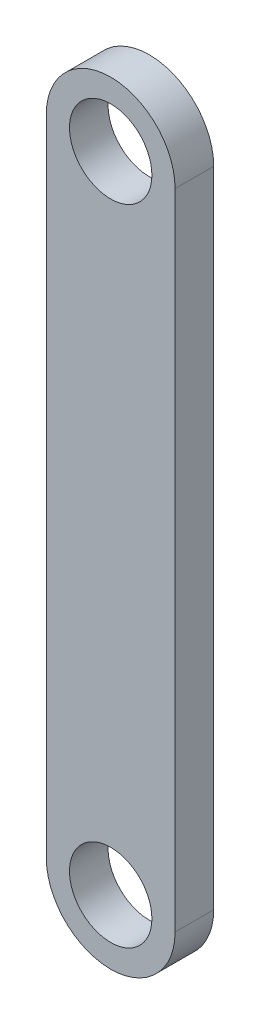
ISO-10303-21;
HEADER;
FILE_DESCRIPTION(('STEP AP214'),'2;1');
FILE_NAME('part.step','',(''),(''),'','','');
FILE_SCHEMA(('AUTOMOTIVE_DESIGN { 1 0 10303 214 1 1 1 1 }'));
ENDSEC;
DATA;
#1=APPLICATION_CONTEXT('core data for automotive mechanical design processes');
#2=APPLICATION_PROTOCOL_DEFINITION('international standard','automotive_design',2000,#1);
#3=PRODUCT_CONTEXT('',#1,'mechanical');
#4=PRODUCT('Part','Part','',(#3));
#5=PRODUCT_RELATED_PRODUCT_CATEGORY('part','',(#4));
#6=PRODUCT_DEFINITION_FORMATION('','',#4);
#7=PRODUCT_DEFINITION_CONTEXT('part definition',#1,'design');
#8=PRODUCT_DEFINITION('design','',#6,#7);
#9=PRODUCT_DEFINITION_SHAPE('','',#8);
#10=(LENGTH_UNIT() NAMED_UNIT(*) SI_UNIT(.MILLI.,.METRE.));
#11=(NAMED_UNIT(*) PLANE_ANGLE_UNIT() SI_UNIT($,.RADIAN.));
#12=(NAMED_UNIT(*) SI_UNIT($,.STERADIAN.) SOLID_ANGLE_UNIT());
#13=UNCERTAINTY_MEASURE_WITH_UNIT(LENGTH_MEASURE(1.E-05),#10,'distance_accuracy_value','');
#14=(GEOMETRIC_REPRESENTATION_CONTEXT(3) GLOBAL_UNCERTAINTY_ASSIGNED_CONTEXT((#13)) GLOBAL_UNIT_ASSIGNED_CONTEXT((#10,
#11,#12)) REPRESENTATION_CONTEXT('',''));
#15=CARTESIAN_POINT('',(0.,0.,0.));
#16=DIRECTION('',(0.,0.,1.));
#17=DIRECTION('',(1.,0.,0.));
#18=AXIS2_PLACEMENT_3D('',#15,#16,#17);
#19=CARTESIAN_POINT('',(10.,0.,6.));
#20=DIRECTION('',(0.,0.,-1.));
#21=DIRECTION('',(-1.,0.,0.));
#22=AXIS2_PLACEMENT_3D('',#19,#20,#21);
#23=PLANE('',#22);
#24=CARTESIAN_POINT('',(10.,0.,6.));
#25=DIRECTION('',(0.,0.,1.));
#26=DIRECTION('',(-1.,0.,0.));
#27=AXIS2_PLACEMENT_3D('',#24,#25,#26);
#28=CIRCLE('',#27,10.);
#29=CARTESIAN_POINT('',(0.,0.,6.));
#30=VERTEX_POINT('',#29);
#31=CARTESIAN_POINT('',(20.,0.,6.));
#32=VERTEX_POINT('',#31);
#33=EDGE_CURVE('E96',#30,#32,#28,.T.);
#34=ORIENTED_EDGE('',*,*,#33,.T.);
#35=DIRECTION('',(0.,1.,0.));
#36=VECTOR('',#35,1.);
#37=CARTESIAN_POINT('',(20.,100.,6.));
#38=LINE('',#37,#36);
#39=CARTESIAN_POINT('',(20.,100.,6.));
#40=VERTEX_POINT('',#39);
#41=EDGE_CURVE('E91',#32,#40,#38,.T.);
#42=ORIENTED_EDGE('',*,*,#41,.T.);
#43=CARTESIAN_POINT('',(9.99999999999998,100.,6.));
#44=DIRECTION('',(0.,0.,1.));
#45=DIRECTION('',(-1.,0.,0.));
#46=AXIS2_PLACEMENT_3D('',#43,#44,#45);
#47=CIRCLE('',#46,10.);
#48=CARTESIAN_POINT('',(0.,100.,6.));
#49=VERTEX_POINT('',#48);
#50=EDGE_CURVE('E94',#40,#49,#47,.T.);
#51=ORIENTED_EDGE('',*,*,#50,.T.);
#52=DIRECTION('',(0.,-1.,0.));
#53=VECTOR('',#52,1.);
#54=CARTESIAN_POINT('',(0.,0.,6.));
#55=LINE('',#54,#53);
#56=EDGE_CURVE('E61',#49,#30,#55,.T.);
#57=ORIENTED_EDGE('',*,*,#56,.T.);
#58=EDGE_LOOP('',(#34,#42,#51,#57));
#59=FACE_BOUND('',#58,.T.);
#60=CARTESIAN_POINT('',(9.99999999999998,100.,6.));
#61=DIRECTION('',(0.,0.,1.));
#62=DIRECTION('',(1.,0.,0.));
#63=AXIS2_PLACEMENT_3D('',#60,#61,#62);
#64=CIRCLE('',#63,6.39999999999999);
#65=CARTESIAN_POINT('',(16.4,100.,6.));
#66=VERTEX_POINT('',#65);
#67=EDGE_CURVE('E116',#66,#66,#64,.T.);
#68=ORIENTED_EDGE('',*,*,#67,.F.);
#69=EDGE_LOOP('',(#68));
#70=FACE_BOUND('',#69,.T.);
#71=CARTESIAN_POINT('',(9.99999999999999,0.,6.));
#72=DIRECTION('',(0.,0.,1.));
#73=DIRECTION('',(1.,0.,0.));
#74=AXIS2_PLACEMENT_3D('',#71,#72,#73);
#75=CIRCLE('',#74,6.40000000000003);
#76=CARTESIAN_POINT('',(16.4,0.,6.));
#77=VERTEX_POINT('',#76);
#78=EDGE_CURVE('E138',#77,#77,#75,.T.);
#79=ORIENTED_EDGE('',*,*,#78,.F.);
#80=EDGE_LOOP('',(#79));
#81=FACE_BOUND('',#80,.T.);
#82=ADVANCED_FACE('F43',(#59,#70,#81),#23,.F.);
#83=CARTESIAN_POINT('',(10.,0.,0.));
#84=DIRECTION('',(0.,0.,-1.));
#85=DIRECTION('',(-1.,0.,0.));
#86=AXIS2_PLACEMENT_3D('',#83,#84,#85);
#87=PLANE('',#86);
#88=CARTESIAN_POINT('',(9.99999999999998,100.,0.));
#89=DIRECTION('',(0.,0.,1.));
#90=DIRECTION('',(1.,0.,0.));
#91=AXIS2_PLACEMENT_3D('',#88,#89,#90);
#92=CIRCLE('',#91,6.39999999999999);
#93=CARTESIAN_POINT('',(16.4,100.,0.));
#94=VERTEX_POINT('',#93);
#95=EDGE_CURVE('E134',#94,#94,#92,.T.);
#96=ORIENTED_EDGE('',*,*,#95,.T.);
#97=EDGE_LOOP('',(#96));
#98=FACE_BOUND('',#97,.T.);
#99=CARTESIAN_POINT('',(10.,0.,0.));
#100=DIRECTION('',(0.,0.,1.));
#101=DIRECTION('',(-1.,0.,0.));
#102=AXIS2_PLACEMENT_3D('',#99,#100,#101);
#103=CIRCLE('',#102,10.);
#104=CARTESIAN_POINT('',(0.,0.,0.));
#105=VERTEX_POINT('',#104);
#106=CARTESIAN_POINT('',(20.,0.,0.));
#107=VERTEX_POINT('',#106);
#108=EDGE_CURVE('E112',#105,#107,#103,.T.);
#109=ORIENTED_EDGE('',*,*,#108,.F.);
#110=DIRECTION('',(0.,-1.,0.));
#111=VECTOR('',#110,1.);
#112=CARTESIAN_POINT('',(0.,0.,0.));
#113=LINE('',#112,#111);
#114=CARTESIAN_POINT('',(0.,100.,0.));
#115=VERTEX_POINT('',#114);
#116=EDGE_CURVE('E84',#115,#105,#113,.T.);
#117=ORIENTED_EDGE('',*,*,#116,.F.);
#118=CARTESIAN_POINT('',(9.99999999999998,100.,0.));
#119=DIRECTION('',(0.,0.,1.));
#120=DIRECTION('',(-1.,0.,0.));
#121=AXIS2_PLACEMENT_3D('',#118,#119,#120);
#122=CIRCLE('',#121,10.);
#123=CARTESIAN_POINT('',(20.,100.,0.));
#124=VERTEX_POINT('',#123);
#125=EDGE_CURVE('E78',#124,#115,#122,.T.);
#126=ORIENTED_EDGE('',*,*,#125,.F.);
#127=DIRECTION('',(0.,1.,0.));
#128=VECTOR('',#127,1.);
#129=CARTESIAN_POINT('',(20.,100.,0.));
#130=LINE('',#129,#128);
#131=EDGE_CURVE('E101',#107,#124,#130,.T.);
#132=ORIENTED_EDGE('',*,*,#131,.F.);
#133=EDGE_LOOP('',(#109,#117,#126,#132));
#134=FACE_BOUND('',#133,.T.);
#135=CARTESIAN_POINT('',(9.99999999999999,0.,0.));
#136=DIRECTION('',(0.,0.,1.));
#137=DIRECTION('',(1.,0.,0.));
#138=AXIS2_PLACEMENT_3D('',#135,#136,#137);
#139=CIRCLE('',#138,6.40000000000003);
#140=CARTESIAN_POINT('',(16.4,0.,0.));
#141=VERTEX_POINT('',#140);
#142=EDGE_CURVE('E142',#141,#141,#139,.T.);
#143=ORIENTED_EDGE('',*,*,#142,.T.);
#144=EDGE_LOOP('',(#143));
#145=FACE_BOUND('',#144,.T.);
#146=ADVANCED_FACE('F129',(#98,#134,#145),#87,.T.);
#147=CARTESIAN_POINT('',(10.,0.,6.));
#148=DIRECTION('',(0.,0.,-1.));
#149=DIRECTION('',(-1.,0.,0.));
#150=AXIS2_PLACEMENT_3D('',#147,#148,#149);
#151=CYLINDRICAL_SURFACE('',#150,10.);
#152=ORIENTED_EDGE('',*,*,#108,.T.);
#153=DIRECTION('',(0.,0.,-1.));
#154=VECTOR('',#153,1.);
#155=CARTESIAN_POINT('',(20.,0.,6.));
#156=LINE('',#155,#154);
#157=EDGE_CURVE('E11',#32,#107,#156,.T.);
#158=ORIENTED_EDGE('',*,*,#157,.F.);
#159=ORIENTED_EDGE('',*,*,#33,.F.);
#160=DIRECTION('',(0.,0.,-1.));
#161=VECTOR('',#160,1.);
#162=CARTESIAN_POINT('',(0.,0.,6.));
#163=LINE('',#162,#161);
#164=EDGE_CURVE('E108',#30,#105,#163,.T.);
#165=ORIENTED_EDGE('',*,*,#164,.T.);
#166=EDGE_LOOP('',(#152,#158,#159,#165));
#167=FACE_BOUND('',#166,.T.);
#168=ADVANCED_FACE('F45',(#167),#151,.T.);
#169=CARTESIAN_POINT('',(20.,100.,6.));
#170=DIRECTION('',(-1.,0.,0.));
#171=DIRECTION('',(0.,-1.,0.));
#172=AXIS2_PLACEMENT_3D('',#169,#170,#171);
#173=PLANE('',#172);
#174=ORIENTED_EDGE('',*,*,#131,.T.);
#175=DIRECTION('',(0.,0.,-1.));
#176=VECTOR('',#175,1.);
#177=CARTESIAN_POINT('',(20.,100.,6.));
#178=LINE('',#177,#176);
#179=EDGE_CURVE('E53',#40,#124,#178,.T.);
#180=ORIENTED_EDGE('',*,*,#179,.F.);
#181=ORIENTED_EDGE('',*,*,#41,.F.);
#182=ORIENTED_EDGE('',*,*,#157,.T.);
#183=EDGE_LOOP('',(#174,#180,#181,#182));
#184=FACE_BOUND('',#183,.T.);
#185=ADVANCED_FACE('F100',(#184),#173,.F.);
#186=CARTESIAN_POINT('',(9.99999999999998,100.,6.));
#187=DIRECTION('',(0.,0.,-1.));
#188=DIRECTION('',(-1.,0.,0.));
#189=AXIS2_PLACEMENT_3D('',#186,#187,#188);
#190=CYLINDRICAL_SURFACE('',#189,10.);
#191=ORIENTED_EDGE('',*,*,#125,.T.);
#192=DIRECTION('',(0.,0.,-1.));
#193=VECTOR('',#192,1.);
#194=CARTESIAN_POINT('',(0.,100.,6.));
#195=LINE('',#194,#193);
#196=EDGE_CURVE('E103',#49,#115,#195,.T.);
#197=ORIENTED_EDGE('',*,*,#196,.F.);
#198=ORIENTED_EDGE('',*,*,#50,.F.);
#199=ORIENTED_EDGE('',*,*,#179,.T.);
#200=EDGE_LOOP('',(#191,#197,#198,#199));
#201=FACE_BOUND('',#200,.T.);
#202=ADVANCED_FACE('F104',(#201),#190,.T.);
#203=CARTESIAN_POINT('',(0.,0.,6.));
#204=DIRECTION('',(1.,0.,0.));
#205=DIRECTION('',(0.,1.,0.));
#206=AXIS2_PLACEMENT_3D('',#203,#204,#205);
#207=PLANE('',#206);
#208=ORIENTED_EDGE('',*,*,#116,.T.);
#209=ORIENTED_EDGE('',*,*,#164,.F.);
#210=ORIENTED_EDGE('',*,*,#56,.F.);
#211=ORIENTED_EDGE('',*,*,#196,.T.);
#212=EDGE_LOOP('',(#208,#209,#210,#211));
#213=FACE_BOUND('',#212,.T.);
#214=ADVANCED_FACE('F126',(#213),#207,.F.);
#215=CARTESIAN_POINT('',(9.99999999999998,100.,6.));
#216=DIRECTION('',(0.,0.,-1.));
#217=DIRECTION('',(-1.,0.,0.));
#218=AXIS2_PLACEMENT_3D('',#215,#216,#217);
#219=CYLINDRICAL_SURFACE('',#218,6.39999999999999);
#220=ORIENTED_EDGE('',*,*,#67,.T.);
#221=EDGE_LOOP('',(#220));
#222=FACE_BOUND('',#221,.T.);
#223=ORIENTED_EDGE('',*,*,#95,.F.);
#224=EDGE_LOOP('',(#223));
#225=FACE_BOUND('',#224,.T.);
#226=ADVANCED_FACE('F161',(#222,#225),#219,.F.);
#227=CARTESIAN_POINT('',(9.99999999999999,0.,6.));
#228=DIRECTION('',(0.,0.,-1.));
#229=DIRECTION('',(-1.,0.,0.));
#230=AXIS2_PLACEMENT_3D('',#227,#228,#229);
#231=CYLINDRICAL_SURFACE('',#230,6.40000000000003);
#232=ORIENTED_EDGE('',*,*,#78,.T.);
#233=EDGE_LOOP('',(#232));
#234=FACE_BOUND('',#233,.T.);
#235=ORIENTED_EDGE('',*,*,#142,.F.);
#236=EDGE_LOOP('',(#235));
#237=FACE_BOUND('',#236,.T.);
#238=ADVANCED_FACE('F150',(#234,#237),#231,.F.);
#239=CLOSED_SHELL('',(#82,#146,#168,#185,#202,#214,#226,#238));
#240=MANIFOLD_SOLID_BREP('B2',#239);
#241=ADVANCED_BREP_SHAPE_REPRESENTATION('',(#18,#240),#14);
#242=SHAPE_DEFINITION_REPRESENTATION(#9,#241);
ENDSEC;
END-ISO-10303-21;
